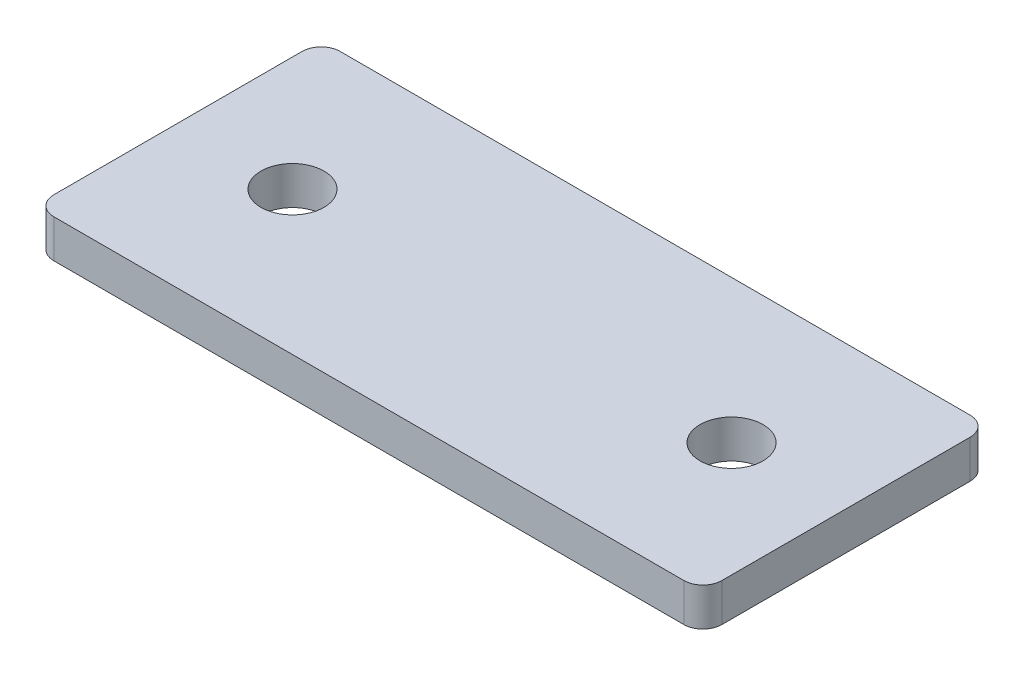
ISO-10303-21;
HEADER;
FILE_DESCRIPTION(('STEP AP214'),'2;1');
FILE_NAME('part.step','',(''),(''),'','','');
FILE_SCHEMA(('AUTOMOTIVE_DESIGN { 1 0 10303 214 1 1 1 1 }'));
ENDSEC;
DATA;
#1=APPLICATION_CONTEXT('core data for automotive mechanical design processes');
#2=APPLICATION_PROTOCOL_DEFINITION('international standard','automotive_design',2000,#1);
#3=PRODUCT_CONTEXT('',#1,'mechanical');
#4=PRODUCT('Part','Part','',(#3));
#5=PRODUCT_RELATED_PRODUCT_CATEGORY('part','',(#4));
#6=PRODUCT_DEFINITION_FORMATION('','',#4);
#7=PRODUCT_DEFINITION_CONTEXT('part definition',#1,'design');
#8=PRODUCT_DEFINITION('design','',#6,#7);
#9=PRODUCT_DEFINITION_SHAPE('','',#8);
#10=(LENGTH_UNIT() NAMED_UNIT(*) SI_UNIT(.MILLI.,.METRE.));
#11=(NAMED_UNIT(*) PLANE_ANGLE_UNIT() SI_UNIT($,.RADIAN.));
#12=(NAMED_UNIT(*) SI_UNIT($,.STERADIAN.) SOLID_ANGLE_UNIT());
#13=UNCERTAINTY_MEASURE_WITH_UNIT(LENGTH_MEASURE(1.E-05),#10,'distance_accuracy_value','');
#14=(GEOMETRIC_REPRESENTATION_CONTEXT(3) GLOBAL_UNCERTAINTY_ASSIGNED_CONTEXT((#13)) GLOBAL_UNIT_ASSIGNED_CONTEXT((#10,
#11,#12)) REPRESENTATION_CONTEXT('',''));
#15=CARTESIAN_POINT('',(0.,0.,0.));
#16=DIRECTION('',(0.,0.,1.));
#17=DIRECTION('',(1.,0.,0.));
#18=AXIS2_PLACEMENT_3D('',#15,#16,#17);
#19=CARTESIAN_POINT('',(-35.,4.,15.));
#20=DIRECTION('',(1.,0.,0.));
#21=DIRECTION('',(0.,0.,-1.));
#22=AXIS2_PLACEMENT_3D('',#19,#20,#21);
#23=PLANE('',#22);
#24=DIRECTION('',(0.,0.,1.));
#25=VECTOR('',#24,1.);
#26=CARTESIAN_POINT('',(-35.,4.,15.));
#27=LINE('',#26,#25);
#28=CARTESIAN_POINT('',(-35.,4.,-13.));
#29=VERTEX_POINT('',#28);
#30=CARTESIAN_POINT('',(-35.,4.,13.));
#31=VERTEX_POINT('',#30);
#32=EDGE_CURVE('E129',#29,#31,#27,.T.);
#33=ORIENTED_EDGE('',*,*,#32,.F.);
#34=DIRECTION('',(0.,-1.,0.));
#35=VECTOR('',#34,1.);
#36=CARTESIAN_POINT('',(-35.,4.,-13.));
#37=LINE('',#36,#35);
#38=CARTESIAN_POINT('',(-35.,0.,-13.));
#39=VERTEX_POINT('',#38);
#40=EDGE_CURVE('E11',#29,#39,#37,.T.);
#41=ORIENTED_EDGE('',*,*,#40,.T.);
#42=DIRECTION('',(0.,0.,1.));
#43=VECTOR('',#42,1.);
#44=CARTESIAN_POINT('',(-35.,0.,15.));
#45=LINE('',#44,#43);
#46=CARTESIAN_POINT('',(-35.,0.,13.));
#47=VERTEX_POINT('',#46);
#48=EDGE_CURVE('E131',#39,#47,#45,.T.);
#49=ORIENTED_EDGE('',*,*,#48,.T.);
#50=DIRECTION('',(0.,-1.,0.));
#51=VECTOR('',#50,1.);
#52=CARTESIAN_POINT('',(-35.,4.,13.));
#53=LINE('',#52,#51);
#54=EDGE_CURVE('E42',#47,#31,#53,.F.);
#55=ORIENTED_EDGE('',*,*,#54,.T.);
#56=EDGE_LOOP('',(#33,#41,#49,#55));
#57=FACE_BOUND('',#56,.T.);
#58=ADVANCED_FACE('F33',(#57),#23,.F.);
#59=CARTESIAN_POINT('',(35.,4.,15.));
#60=DIRECTION('',(0.,0.,-1.));
#61=DIRECTION('',(-1.,0.,0.));
#62=AXIS2_PLACEMENT_3D('',#59,#60,#61);
#63=PLANE('',#62);
#64=DIRECTION('',(1.,0.,0.));
#65=VECTOR('',#64,1.);
#66=CARTESIAN_POINT('',(35.,0.,15.));
#67=LINE('',#66,#65);
#68=CARTESIAN_POINT('',(-33.,0.,15.));
#69=VERTEX_POINT('',#68);
#70=CARTESIAN_POINT('',(33.,0.,15.));
#71=VERTEX_POINT('',#70);
#72=EDGE_CURVE('E127',#69,#71,#67,.T.);
#73=ORIENTED_EDGE('',*,*,#72,.T.);
#74=DIRECTION('',(0.,-1.,0.));
#75=VECTOR('',#74,1.);
#76=CARTESIAN_POINT('',(33.,4.,15.));
#77=LINE('',#76,#75);
#78=CARTESIAN_POINT('',(33.,4.,15.));
#79=VERTEX_POINT('',#78);
#80=EDGE_CURVE('E106',#71,#79,#77,.F.);
#81=ORIENTED_EDGE('',*,*,#80,.T.);
#82=DIRECTION('',(1.,0.,0.));
#83=VECTOR('',#82,1.);
#84=CARTESIAN_POINT('',(35.,4.,15.));
#85=LINE('',#84,#83);
#86=CARTESIAN_POINT('',(-33.,4.,15.));
#87=VERTEX_POINT('',#86);
#88=EDGE_CURVE('E168',#87,#79,#85,.T.);
#89=ORIENTED_EDGE('',*,*,#88,.F.);
#90=DIRECTION('',(0.,-1.,0.));
#91=VECTOR('',#90,1.);
#92=CARTESIAN_POINT('',(-33.,4.,15.));
#93=LINE('',#92,#91);
#94=EDGE_CURVE('E111',#87,#69,#93,.T.);
#95=ORIENTED_EDGE('',*,*,#94,.T.);
#96=EDGE_LOOP('',(#73,#81,#89,#95));
#97=FACE_BOUND('',#96,.T.);
#98=ADVANCED_FACE('F172',(#97),#63,.F.);
#99=CARTESIAN_POINT('',(35.,4.,15.));
#100=DIRECTION('',(-1.,0.,0.));
#101=DIRECTION('',(0.,0.,1.));
#102=AXIS2_PLACEMENT_3D('',#99,#100,#101);
#103=PLANE('',#102);
#104=DIRECTION('',(0.,0.,-1.));
#105=VECTOR('',#104,1.);
#106=CARTESIAN_POINT('',(35.,4.,15.));
#107=LINE('',#106,#105);
#108=CARTESIAN_POINT('',(35.,4.,13.));
#109=VERTEX_POINT('',#108);
#110=CARTESIAN_POINT('',(35.,4.,-13.));
#111=VERTEX_POINT('',#110);
#112=EDGE_CURVE('E120',#109,#111,#107,.T.);
#113=ORIENTED_EDGE('',*,*,#112,.F.);
#114=DIRECTION('',(0.,-1.,0.));
#115=VECTOR('',#114,1.);
#116=CARTESIAN_POINT('',(35.,4.,13.));
#117=LINE('',#116,#115);
#118=CARTESIAN_POINT('',(35.,0.,13.));
#119=VERTEX_POINT('',#118);
#120=EDGE_CURVE('E105',#109,#119,#117,.T.);
#121=ORIENTED_EDGE('',*,*,#120,.T.);
#122=DIRECTION('',(0.,0.,-1.));
#123=VECTOR('',#122,1.);
#124=CARTESIAN_POINT('',(35.,0.,15.));
#125=LINE('',#124,#123);
#126=CARTESIAN_POINT('',(35.,0.,-13.));
#127=VERTEX_POINT('',#126);
#128=EDGE_CURVE('E118',#119,#127,#125,.T.);
#129=ORIENTED_EDGE('',*,*,#128,.T.);
#130=DIRECTION('',(0.,-1.,0.));
#131=VECTOR('',#130,1.);
#132=CARTESIAN_POINT('',(35.,4.,-13.));
#133=LINE('',#132,#131);
#134=EDGE_CURVE('E122',#127,#111,#133,.F.);
#135=ORIENTED_EDGE('',*,*,#134,.T.);
#136=EDGE_LOOP('',(#113,#121,#129,#135));
#137=FACE_BOUND('',#136,.T.);
#138=ADVANCED_FACE('F117',(#137),#103,.F.);
#139=CARTESIAN_POINT('',(35.,4.,-15.));
#140=DIRECTION('',(0.,0.,1.));
#141=DIRECTION('',(1.,0.,0.));
#142=AXIS2_PLACEMENT_3D('',#139,#140,#141);
#143=PLANE('',#142);
#144=DIRECTION('',(-1.,0.,0.));
#145=VECTOR('',#144,1.);
#146=CARTESIAN_POINT('',(35.,4.,-15.));
#147=LINE('',#146,#145);
#148=CARTESIAN_POINT('',(33.,4.,-15.));
#149=VERTEX_POINT('',#148);
#150=CARTESIAN_POINT('',(-33.,4.,-15.));
#151=VERTEX_POINT('',#150);
#152=EDGE_CURVE('E135',#149,#151,#147,.T.);
#153=ORIENTED_EDGE('',*,*,#152,.F.);
#154=DIRECTION('',(0.,-1.,0.));
#155=VECTOR('',#154,1.);
#156=CARTESIAN_POINT('',(33.,4.,-15.));
#157=LINE('',#156,#155);
#158=CARTESIAN_POINT('',(33.,0.,-15.));
#159=VERTEX_POINT('',#158);
#160=EDGE_CURVE('E152',#149,#159,#157,.T.);
#161=ORIENTED_EDGE('',*,*,#160,.T.);
#162=DIRECTION('',(-1.,0.,0.));
#163=VECTOR('',#162,1.);
#164=CARTESIAN_POINT('',(35.,0.,-15.));
#165=LINE('',#164,#163);
#166=CARTESIAN_POINT('',(-33.,0.,-15.));
#167=VERTEX_POINT('',#166);
#168=EDGE_CURVE('E126',#159,#167,#165,.T.);
#169=ORIENTED_EDGE('',*,*,#168,.T.);
#170=DIRECTION('',(0.,-1.,0.));
#171=VECTOR('',#170,1.);
#172=CARTESIAN_POINT('',(-33.,4.,-15.));
#173=LINE('',#172,#171);
#174=EDGE_CURVE('E49',#167,#151,#173,.F.);
#175=ORIENTED_EDGE('',*,*,#174,.T.);
#176=EDGE_LOOP('',(#153,#161,#169,#175));
#177=FACE_BOUND('',#176,.T.);
#178=ADVANCED_FACE('F193',(#177),#143,.F.);
#179=CARTESIAN_POINT('',(0.,4.,0.));
#180=DIRECTION('',(0.,1.,0.));
#181=DIRECTION('',(0.,0.,1.));
#182=AXIS2_PLACEMENT_3D('',#179,#180,#181);
#183=PLANE('',#182);
#184=CARTESIAN_POINT('',(-23.,4.,0.));
#185=DIRECTION('',(0.,1.,0.));
#186=DIRECTION('',(0.,0.,1.));
#187=AXIS2_PLACEMENT_3D('',#184,#185,#186);
#188=CIRCLE('',#187,3.3);
#189=CARTESIAN_POINT('',(-23.,4.,3.3));
#190=VERTEX_POINT('',#189);
#191=EDGE_CURVE('E184',#190,#190,#188,.T.);
#192=ORIENTED_EDGE('',*,*,#191,.F.);
#193=EDGE_LOOP('',(#192));
#194=FACE_BOUND('',#193,.T.);
#195=CARTESIAN_POINT('',(23.,4.,0.));
#196=DIRECTION('',(0.,1.,0.));
#197=DIRECTION('',(0.,0.,1.));
#198=AXIS2_PLACEMENT_3D('',#195,#196,#197);
#199=CIRCLE('',#198,3.3);
#200=CARTESIAN_POINT('',(23.,4.,3.29999999999999));
#201=VERTEX_POINT('',#200);
#202=EDGE_CURVE('E174',#201,#201,#199,.T.);
#203=ORIENTED_EDGE('',*,*,#202,.F.);
#204=EDGE_LOOP('',(#203));
#205=FACE_BOUND('',#204,.T.);
#206=ORIENTED_EDGE('',*,*,#88,.T.);
#207=CARTESIAN_POINT('',(33.,4.,13.));
#208=DIRECTION('',(0.,1.,0.));
#209=DIRECTION('',(0.,0.,1.));
#210=AXIS2_PLACEMENT_3D('',#207,#208,#209);
#211=CIRCLE('',#210,2.);
#212=EDGE_CURVE('E149',#79,#109,#211,.T.);
#213=ORIENTED_EDGE('',*,*,#212,.T.);
#214=ORIENTED_EDGE('',*,*,#112,.T.);
#215=CARTESIAN_POINT('',(33.,4.,-13.));
#216=DIRECTION('',(0.,1.,0.));
#217=DIRECTION('',(0.,0.,1.));
#218=AXIS2_PLACEMENT_3D('',#215,#216,#217);
#219=CIRCLE('',#218,2.);
#220=EDGE_CURVE('E56',#111,#149,#219,.T.);
#221=ORIENTED_EDGE('',*,*,#220,.T.);
#222=ORIENTED_EDGE('',*,*,#152,.T.);
#223=CARTESIAN_POINT('',(-33.,4.,-13.));
#224=DIRECTION('',(0.,1.,0.));
#225=DIRECTION('',(0.,0.,1.));
#226=AXIS2_PLACEMENT_3D('',#223,#224,#225);
#227=CIRCLE('',#226,2.);
#228=EDGE_CURVE('E146',#151,#29,#227,.T.);
#229=ORIENTED_EDGE('',*,*,#228,.T.);
#230=ORIENTED_EDGE('',*,*,#32,.T.);
#231=CARTESIAN_POINT('',(-33.,4.,13.));
#232=DIRECTION('',(0.,1.,0.));
#233=DIRECTION('',(0.,0.,1.));
#234=AXIS2_PLACEMENT_3D('',#231,#232,#233);
#235=CIRCLE('',#234,2.);
#236=EDGE_CURVE('E144',#31,#87,#235,.T.);
#237=ORIENTED_EDGE('',*,*,#236,.T.);
#238=EDGE_LOOP('',(#206,#213,#214,#221,#222,#229,#230,#237));
#239=FACE_BOUND('',#238,.T.);
#240=ADVANCED_FACE('F165',(#194,#205,#239),#183,.T.);
#241=CARTESIAN_POINT('',(0.,0.,0.));
#242=DIRECTION('',(0.,1.,0.));
#243=DIRECTION('',(0.,0.,1.));
#244=AXIS2_PLACEMENT_3D('',#241,#242,#243);
#245=PLANE('',#244);
#246=CARTESIAN_POINT('',(-23.,0.,0.));
#247=DIRECTION('',(0.,1.,0.));
#248=DIRECTION('',(0.,0.,1.));
#249=AXIS2_PLACEMENT_3D('',#246,#247,#248);
#250=CIRCLE('',#249,3.3);
#251=CARTESIAN_POINT('',(-23.,0.,3.3));
#252=VERTEX_POINT('',#251);
#253=EDGE_CURVE('E181',#252,#252,#250,.T.);
#254=ORIENTED_EDGE('',*,*,#253,.T.);
#255=EDGE_LOOP('',(#254));
#256=FACE_BOUND('',#255,.T.);
#257=CARTESIAN_POINT('',(23.,0.,0.));
#258=DIRECTION('',(0.,1.,0.));
#259=DIRECTION('',(0.,0.,1.));
#260=AXIS2_PLACEMENT_3D('',#257,#258,#259);
#261=CIRCLE('',#260,3.3);
#262=CARTESIAN_POINT('',(23.,0.,3.29999999999999));
#263=VERTEX_POINT('',#262);
#264=EDGE_CURVE('E37',#263,#263,#261,.T.);
#265=ORIENTED_EDGE('',*,*,#264,.T.);
#266=EDGE_LOOP('',(#265));
#267=FACE_BOUND('',#266,.T.);
#268=ORIENTED_EDGE('',*,*,#128,.F.);
#269=CARTESIAN_POINT('',(33.,0.,13.));
#270=DIRECTION('',(0.,1.,0.));
#271=DIRECTION('',(0.,0.,1.));
#272=AXIS2_PLACEMENT_3D('',#269,#270,#271);
#273=CIRCLE('',#272,2.);
#274=EDGE_CURVE('E101',#119,#71,#273,.F.);
#275=ORIENTED_EDGE('',*,*,#274,.T.);
#276=ORIENTED_EDGE('',*,*,#72,.F.);
#277=CARTESIAN_POINT('',(-33.,0.,13.));
#278=DIRECTION('',(0.,1.,0.));
#279=DIRECTION('',(0.,0.,1.));
#280=AXIS2_PLACEMENT_3D('',#277,#278,#279);
#281=CIRCLE('',#280,2.);
#282=EDGE_CURVE('E121',#69,#47,#281,.F.);
#283=ORIENTED_EDGE('',*,*,#282,.T.);
#284=ORIENTED_EDGE('',*,*,#48,.F.);
#285=CARTESIAN_POINT('',(-33.,0.,-13.));
#286=DIRECTION('',(0.,1.,0.));
#287=DIRECTION('',(0.,0.,1.));
#288=AXIS2_PLACEMENT_3D('',#285,#286,#287);
#289=CIRCLE('',#288,2.);
#290=EDGE_CURVE('E138',#39,#167,#289,.F.);
#291=ORIENTED_EDGE('',*,*,#290,.T.);
#292=ORIENTED_EDGE('',*,*,#168,.F.);
#293=CARTESIAN_POINT('',(33.,0.,-13.));
#294=DIRECTION('',(0.,1.,0.));
#295=DIRECTION('',(0.,0.,1.));
#296=AXIS2_PLACEMENT_3D('',#293,#294,#295);
#297=CIRCLE('',#296,2.);
#298=EDGE_CURVE('E112',#159,#127,#297,.F.);
#299=ORIENTED_EDGE('',*,*,#298,.T.);
#300=EDGE_LOOP('',(#268,#275,#276,#283,#284,#291,#292,#299));
#301=FACE_BOUND('',#300,.T.);
#302=ADVANCED_FACE('F124',(#256,#267,#301),#245,.F.);
#303=CARTESIAN_POINT('',(33.,4.,13.));
#304=DIRECTION('',(0.,-1.,0.));
#305=DIRECTION('',(0.,0.,-1.));
#306=AXIS2_PLACEMENT_3D('',#303,#304,#305);
#307=CYLINDRICAL_SURFACE('',#306,2.);
#308=ORIENTED_EDGE('',*,*,#212,.F.);
#309=ORIENTED_EDGE('',*,*,#80,.F.);
#310=ORIENTED_EDGE('',*,*,#274,.F.);
#311=ORIENTED_EDGE('',*,*,#120,.F.);
#312=EDGE_LOOP('',(#308,#309,#310,#311));
#313=FACE_BOUND('',#312,.T.);
#314=ADVANCED_FACE('F104',(#313),#307,.T.);
#315=CARTESIAN_POINT('',(33.,4.,-13.));
#316=DIRECTION('',(0.,-1.,0.));
#317=DIRECTION('',(0.,0.,-1.));
#318=AXIS2_PLACEMENT_3D('',#315,#316,#317);
#319=CYLINDRICAL_SURFACE('',#318,2.);
#320=ORIENTED_EDGE('',*,*,#220,.F.);
#321=ORIENTED_EDGE('',*,*,#134,.F.);
#322=ORIENTED_EDGE('',*,*,#298,.F.);
#323=ORIENTED_EDGE('',*,*,#160,.F.);
#324=EDGE_LOOP('',(#320,#321,#322,#323));
#325=FACE_BOUND('',#324,.T.);
#326=ADVANCED_FACE('F209',(#325),#319,.T.);
#327=CARTESIAN_POINT('',(-33.,4.,-13.));
#328=DIRECTION('',(0.,-1.,0.));
#329=DIRECTION('',(0.,0.,-1.));
#330=AXIS2_PLACEMENT_3D('',#327,#328,#329);
#331=CYLINDRICAL_SURFACE('',#330,2.);
#332=ORIENTED_EDGE('',*,*,#228,.F.);
#333=ORIENTED_EDGE('',*,*,#174,.F.);
#334=ORIENTED_EDGE('',*,*,#290,.F.);
#335=ORIENTED_EDGE('',*,*,#40,.F.);
#336=EDGE_LOOP('',(#332,#333,#334,#335));
#337=FACE_BOUND('',#336,.T.);
#338=ADVANCED_FACE('F221',(#337),#331,.T.);
#339=CARTESIAN_POINT('',(-33.,4.,13.));
#340=DIRECTION('',(0.,-1.,0.));
#341=DIRECTION('',(0.,0.,-1.));
#342=AXIS2_PLACEMENT_3D('',#339,#340,#341);
#343=CYLINDRICAL_SURFACE('',#342,2.);
#344=ORIENTED_EDGE('',*,*,#236,.F.);
#345=ORIENTED_EDGE('',*,*,#54,.F.);
#346=ORIENTED_EDGE('',*,*,#282,.F.);
#347=ORIENTED_EDGE('',*,*,#94,.F.);
#348=EDGE_LOOP('',(#344,#345,#346,#347));
#349=FACE_BOUND('',#348,.T.);
#350=ADVANCED_FACE('F35',(#349),#343,.T.);
#351=CARTESIAN_POINT('',(23.,4.,0.));
#352=DIRECTION('',(0.,1.,0.));
#353=DIRECTION('',(0.,0.,1.));
#354=AXIS2_PLACEMENT_3D('',#351,#352,#353);
#355=CYLINDRICAL_SURFACE('',#354,3.3);
#356=ORIENTED_EDGE('',*,*,#202,.T.);
#357=EDGE_LOOP('',(#356));
#358=FACE_BOUND('',#357,.T.);
#359=ORIENTED_EDGE('',*,*,#264,.F.);
#360=EDGE_LOOP('',(#359));
#361=FACE_BOUND('',#360,.T.);
#362=ADVANCED_FACE('F197',(#358,#361),#355,.F.);
#363=CARTESIAN_POINT('',(-23.,4.,0.));
#364=DIRECTION('',(0.,1.,0.));
#365=DIRECTION('',(0.,0.,1.));
#366=AXIS2_PLACEMENT_3D('',#363,#364,#365);
#367=CYLINDRICAL_SURFACE('',#366,3.3);
#368=ORIENTED_EDGE('',*,*,#191,.T.);
#369=EDGE_LOOP('',(#368));
#370=FACE_BOUND('',#369,.T.);
#371=ORIENTED_EDGE('',*,*,#253,.F.);
#372=EDGE_LOOP('',(#371));
#373=FACE_BOUND('',#372,.T.);
#374=ADVANCED_FACE('F188',(#370,#373),#367,.F.);
#375=CLOSED_SHELL('',(#58,#98,#138,#178,#240,#302,#314,#326,#338,#350,#362,#374));
#376=MANIFOLD_SOLID_BREP('B2',#375);
#377=ADVANCED_BREP_SHAPE_REPRESENTATION('',(#18,#376),#14);
#378=SHAPE_DEFINITION_REPRESENTATION(#9,#377);
ENDSEC;
END-ISO-10303-21;
